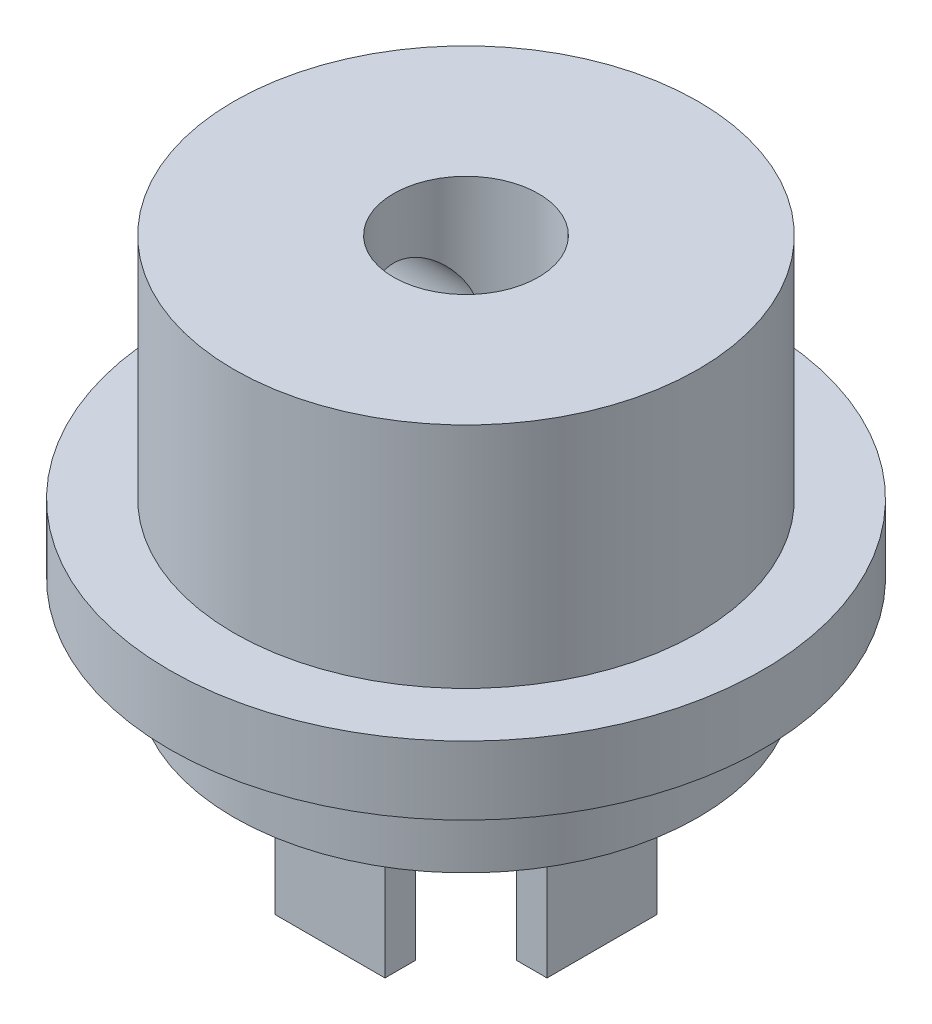
ISO-10303-21;
HEADER;
FILE_DESCRIPTION(('STEP AP214'),'2;1');
FILE_NAME('part.step','',(''),(''),'','','');
FILE_SCHEMA(('AUTOMOTIVE_DESIGN { 1 0 10303 214 1 1 1 1 }'));
ENDSEC;
DATA;
#1=APPLICATION_CONTEXT('core data for automotive mechanical design processes');
#2=APPLICATION_PROTOCOL_DEFINITION('international standard','automotive_design',2000,#1);
#3=PRODUCT_CONTEXT('',#1,'mechanical');
#4=PRODUCT('Part','Part','',(#3));
#5=PRODUCT_RELATED_PRODUCT_CATEGORY('part','',(#4));
#6=PRODUCT_DEFINITION_FORMATION('','',#4);
#7=PRODUCT_DEFINITION_CONTEXT('part definition',#1,'design');
#8=PRODUCT_DEFINITION('design','',#6,#7);
#9=PRODUCT_DEFINITION_SHAPE('','',#8);
#10=(LENGTH_UNIT() NAMED_UNIT(*) SI_UNIT(.MILLI.,.METRE.));
#11=(NAMED_UNIT(*) PLANE_ANGLE_UNIT() SI_UNIT($,.RADIAN.));
#12=(NAMED_UNIT(*) SI_UNIT($,.STERADIAN.) SOLID_ANGLE_UNIT());
#13=UNCERTAINTY_MEASURE_WITH_UNIT(LENGTH_MEASURE(1.E-05),#10,'distance_accuracy_value','');
#14=(GEOMETRIC_REPRESENTATION_CONTEXT(3) GLOBAL_UNCERTAINTY_ASSIGNED_CONTEXT((#13)) GLOBAL_UNIT_ASSIGNED_CONTEXT((#10,
#11,#12)) REPRESENTATION_CONTEXT('',''));
#15=CARTESIAN_POINT('',(0.,0.,0.));
#16=DIRECTION('',(0.,0.,1.));
#17=DIRECTION('',(1.,0.,0.));
#18=AXIS2_PLACEMENT_3D('',#15,#16,#17);
#19=CARTESIAN_POINT('',(0.,-3.,0.));
#20=DIRECTION('',(0.,1.,0.));
#21=DIRECTION('',(0.,0.,1.));
#22=AXIS2_PLACEMENT_3D('',#19,#20,#21);
#23=CYLINDRICAL_SURFACE('',#22,10.175);
#24=CARTESIAN_POINT('',(0.,-3.,0.));
#25=DIRECTION('',(0.,1.,0.));
#26=DIRECTION('',(0.,0.,1.));
#27=AXIS2_PLACEMENT_3D('',#24,#25,#26);
#28=CIRCLE('',#27,10.175);
#29=CARTESIAN_POINT('',(0.,-3.,10.175));
#30=VERTEX_POINT('',#29);
#31=EDGE_CURVE('E50',#30,#30,#28,.T.);
#32=ORIENTED_EDGE('',*,*,#31,.F.);
#33=EDGE_LOOP('',(#32));
#34=FACE_BOUND('',#33,.T.);
#35=CARTESIAN_POINT('',(0.,0.,0.));
#36=DIRECTION('',(0.,1.,0.));
#37=DIRECTION('',(0.,0.,1.));
#38=AXIS2_PLACEMENT_3D('',#35,#36,#37);
#39=CIRCLE('',#38,10.175);
#40=CARTESIAN_POINT('',(0.,0.,10.175));
#41=VERTEX_POINT('',#40);
#42=EDGE_CURVE('E56',#41,#41,#39,.T.);
#43=ORIENTED_EDGE('',*,*,#42,.T.);
#44=EDGE_LOOP('',(#43));
#45=FACE_BOUND('',#44,.T.);
#46=ADVANCED_FACE('F43',(#34,#45),#23,.F.);
#47=CARTESIAN_POINT('',(0.,-3.,0.));
#48=DIRECTION('',(0.,1.,0.));
#49=DIRECTION('',(0.,0.,1.));
#50=AXIS2_PLACEMENT_3D('',#47,#48,#49);
#51=CYLINDRICAL_SURFACE('',#50,13.);
#52=CARTESIAN_POINT('',(0.,-3.,0.));
#53=DIRECTION('',(0.,1.,0.));
#54=DIRECTION('',(0.,0.,1.));
#55=AXIS2_PLACEMENT_3D('',#52,#53,#54);
#56=CIRCLE('',#55,13.);
#57=CARTESIAN_POINT('',(0.,-3.,13.));
#58=VERTEX_POINT('',#57);
#59=EDGE_CURVE('E11',#58,#58,#56,.T.);
#60=ORIENTED_EDGE('',*,*,#59,.T.);
#61=EDGE_LOOP('',(#60));
#62=FACE_BOUND('',#61,.T.);
#63=CARTESIAN_POINT('',(0.,0.,0.));
#64=DIRECTION('',(0.,1.,0.));
#65=DIRECTION('',(0.,0.,1.));
#66=AXIS2_PLACEMENT_3D('',#63,#64,#65);
#67=CIRCLE('',#66,13.);
#68=CARTESIAN_POINT('',(0.,0.,13.));
#69=VERTEX_POINT('',#68);
#70=EDGE_CURVE('E46',#69,#69,#67,.T.);
#71=ORIENTED_EDGE('',*,*,#70,.F.);
#72=EDGE_LOOP('',(#71));
#73=FACE_BOUND('',#72,.T.);
#74=ADVANCED_FACE('F65',(#62,#73),#51,.T.);
#75=CARTESIAN_POINT('',(0.,-3.,0.));
#76=DIRECTION('',(0.,1.,0.));
#77=DIRECTION('',(0.,0.,1.));
#78=AXIS2_PLACEMENT_3D('',#75,#76,#77);
#79=PLANE('',#78);
#80=ORIENTED_EDGE('',*,*,#31,.T.);
#81=EDGE_LOOP('',(#80));
#82=FACE_BOUND('',#81,.T.);
#83=ORIENTED_EDGE('',*,*,#59,.F.);
#84=EDGE_LOOP('',(#83));
#85=FACE_BOUND('',#84,.T.);
#86=ADVANCED_FACE('F67',(#82,#85),#79,.F.);
#87=CARTESIAN_POINT('',(0.,0.,0.));
#88=DIRECTION('',(0.,1.,0.));
#89=DIRECTION('',(0.,0.,1.));
#90=AXIS2_PLACEMENT_3D('',#87,#88,#89);
#91=PLANE('',#90);
#92=ORIENTED_EDGE('',*,*,#42,.F.);
#93=EDGE_LOOP('',(#92));
#94=FACE_BOUND('',#93,.T.);
#95=ORIENTED_EDGE('',*,*,#70,.T.);
#96=EDGE_LOOP('',(#95));
#97=FACE_BOUND('',#96,.T.);
#98=ADVANCED_FACE('F63',(#94,#97),#91,.T.);
#99=CLOSED_SHELL('',(#46,#74,#86,#98));
#100=MANIFOLD_SOLID_BREP('B2',#99);
#101=CARTESIAN_POINT('',(0.,-7.,0.));
#102=DIRECTION('',(0.,1.,0.));
#103=DIRECTION('',(0.,0.,1.));
#104=AXIS2_PLACEMENT_3D('',#101,#102,#103);
#105=PLANE('',#104);
#106=DIRECTION('',(-1.,0.,0.));
#107=VECTOR('',#106,1.);
#108=CARTESIAN_POINT('',(2.40741004928687,-7.,-4.6111649552997));
#109=LINE('',#108,#107);
#110=CARTESIAN_POINT('',(2.40741004928687,-7.,-4.6111649552997));
#111=VERTEX_POINT('',#110);
#112=CARTESIAN_POINT('',(-2.40741004928404,-7.,-4.6111649552997));
#113=VERTEX_POINT('',#112);
#114=EDGE_CURVE('E244',#111,#113,#109,.T.);
#115=ORIENTED_EDGE('',*,*,#114,.F.);
#116=DIRECTION('',(0.,0.,1.));
#117=VECTOR('',#116,1.);
#118=CARTESIAN_POINT('',(2.40741004928687,-7.,-5.95931458289955));
#119=LINE('',#118,#117);
#120=CARTESIAN_POINT('',(2.40741004928687,-7.,-5.95931458289955));
#121=VERTEX_POINT('',#120);
#122=EDGE_CURVE('E257',#121,#111,#119,.T.);
#123=ORIENTED_EDGE('',*,*,#122,.F.);
#124=DIRECTION('',(1.,0.,0.));
#125=VECTOR('',#124,1.);
#126=CARTESIAN_POINT('',(2.40741004928687,-7.,-5.95931458289955));
#127=LINE('',#126,#125);
#128=CARTESIAN_POINT('',(-2.40741004928404,-7.,-5.95931458289955));
#129=VERTEX_POINT('',#128);
#130=EDGE_CURVE('E266',#129,#121,#127,.T.);
#131=ORIENTED_EDGE('',*,*,#130,.F.);
#132=DIRECTION('',(0.,0.,-1.));
#133=VECTOR('',#132,1.);
#134=CARTESIAN_POINT('',(-2.40741004928404,-7.,-5.95931458289955));
#135=LINE('',#134,#133);
#136=EDGE_CURVE('E247',#113,#129,#135,.T.);
#137=ORIENTED_EDGE('',*,*,#136,.F.);
#138=EDGE_LOOP('',(#115,#123,#131,#137));
#139=FACE_BOUND('',#138,.T.);
#140=DIRECTION('',(0.,0.,1.));
#141=VECTOR('',#140,1.);
#142=CARTESIAN_POINT('',(2.40741004928545,-7.,5.95931458289928));
#143=LINE('',#142,#141);
#144=CARTESIAN_POINT('',(2.40741004928545,-7.,4.61116495529942));
#145=VERTEX_POINT('',#144);
#146=CARTESIAN_POINT('',(2.40741004928545,-7.,5.95931458289928));
#147=VERTEX_POINT('',#146);
#148=EDGE_CURVE('E315',#145,#147,#143,.T.);
#149=ORIENTED_EDGE('',*,*,#148,.F.);
#150=DIRECTION('',(1.,0.,0.));
#151=VECTOR('',#150,1.);
#152=CARTESIAN_POINT('',(-2.40741004928545,-7.,4.61116495529942));
#153=LINE('',#152,#151);
#154=CARTESIAN_POINT('',(-2.40741004928545,-7.,4.61116495529942));
#155=VERTEX_POINT('',#154);
#156=EDGE_CURVE('E320',#155,#145,#153,.T.);
#157=ORIENTED_EDGE('',*,*,#156,.F.);
#158=DIRECTION('',(0.,0.,-1.));
#159=VECTOR('',#158,1.);
#160=CARTESIAN_POINT('',(-2.40741004928545,-7.,5.95931458289928));
#161=LINE('',#160,#159);
#162=CARTESIAN_POINT('',(-2.40741004928545,-7.,5.95931458289928));
#163=VERTEX_POINT('',#162);
#164=EDGE_CURVE('E332',#163,#155,#161,.T.);
#165=ORIENTED_EDGE('',*,*,#164,.F.);
#166=DIRECTION('',(-1.,0.,0.));
#167=VECTOR('',#166,1.);
#168=CARTESIAN_POINT('',(-2.40741004928545,-7.,5.95931458289928));
#169=LINE('',#168,#167);
#170=EDGE_CURVE('E329',#147,#163,#169,.T.);
#171=ORIENTED_EDGE('',*,*,#170,.F.);
#172=EDGE_LOOP('',(#149,#157,#165,#171));
#173=FACE_BOUND('',#172,.T.);
#174=CARTESIAN_POINT('',(0.,-7.,0.));
#175=DIRECTION('',(0.,1.,0.));
#176=DIRECTION('',(0.,0.,1.));
#177=AXIS2_PLACEMENT_3D('',#174,#175,#176);
#178=CIRCLE('',#177,3.175);
#179=CARTESIAN_POINT('',(0.,-7.,3.175));
#180=VERTEX_POINT('',#179);
#181=EDGE_CURVE('E118',#180,#180,#178,.T.);
#182=ORIENTED_EDGE('',*,*,#181,.T.);
#183=EDGE_LOOP('',(#182));
#184=FACE_BOUND('',#183,.T.);
#185=CARTESIAN_POINT('',(0.,-7.,0.));
#186=DIRECTION('',(0.,1.,0.));
#187=DIRECTION('',(0.,0.,1.));
#188=AXIS2_PLACEMENT_3D('',#185,#186,#187);
#189=CIRCLE('',#188,10.175);
#190=CARTESIAN_POINT('',(0.,-7.,10.175));
#191=VERTEX_POINT('',#190);
#192=EDGE_CURVE('E41',#191,#191,#189,.T.);
#193=ORIENTED_EDGE('',*,*,#192,.F.);
#194=EDGE_LOOP('',(#193));
#195=FACE_BOUND('',#194,.T.);
#196=DIRECTION('',(0.,0.,-1.));
#197=VECTOR('',#196,1.);
#198=CARTESIAN_POINT('',(4.61116495530027,-7.,2.40741004928602));
#199=LINE('',#198,#197);
#200=CARTESIAN_POINT('',(4.61116495530027,-7.,2.40741004928602));
#201=VERTEX_POINT('',#200);
#202=CARTESIAN_POINT('',(4.61116495530027,-7.,-2.40741004928489));
#203=VERTEX_POINT('',#202);
#204=EDGE_CURVE('E282',#201,#203,#199,.T.);
#205=ORIENTED_EDGE('',*,*,#204,.F.);
#206=DIRECTION('',(-1.,0.,0.));
#207=VECTOR('',#206,1.);
#208=CARTESIAN_POINT('',(5.95931458290012,-7.,2.40741004928602));
#209=LINE('',#208,#207);
#210=CARTESIAN_POINT('',(5.95931458290012,-7.,2.40741004928602));
#211=VERTEX_POINT('',#210);
#212=EDGE_CURVE('E287',#211,#201,#209,.T.);
#213=ORIENTED_EDGE('',*,*,#212,.F.);
#214=DIRECTION('',(0.,0.,1.));
#215=VECTOR('',#214,1.);
#216=CARTESIAN_POINT('',(5.95931458290012,-7.,2.40741004928602));
#217=LINE('',#216,#215);
#218=CARTESIAN_POINT('',(5.95931458290012,-7.,-2.40741004928489));
#219=VERTEX_POINT('',#218);
#220=EDGE_CURVE('E299',#219,#211,#217,.T.);
#221=ORIENTED_EDGE('',*,*,#220,.F.);
#222=DIRECTION('',(1.,0.,0.));
#223=VECTOR('',#222,1.);
#224=CARTESIAN_POINT('',(5.95931458290012,-7.,-2.40741004928489));
#225=LINE('',#224,#223);
#226=EDGE_CURVE('E296',#203,#219,#225,.T.);
#227=ORIENTED_EDGE('',*,*,#226,.F.);
#228=EDGE_LOOP('',(#205,#213,#221,#227));
#229=FACE_BOUND('',#228,.T.);
#230=DIRECTION('',(0.,0.,1.));
#231=VECTOR('',#230,1.);
#232=CARTESIAN_POINT('',(-4.61116495529885,-7.,-2.4074100492863));
#233=LINE('',#232,#231);
#234=CARTESIAN_POINT('',(-4.61116495529885,-7.,-2.4074100492863));
#235=VERTEX_POINT('',#234);
#236=CARTESIAN_POINT('',(-4.61116495529886,-7.,2.40741004928461));
#237=VERTEX_POINT('',#236);
#238=EDGE_CURVE('E243',#235,#237,#233,.T.);
#239=ORIENTED_EDGE('',*,*,#238,.F.);
#240=DIRECTION('',(1.,0.,0.));
#241=VECTOR('',#240,1.);
#242=CARTESIAN_POINT('',(-5.95931458289871,-7.,-2.4074100492863));
#243=LINE('',#242,#241);
#244=CARTESIAN_POINT('',(-5.95931458289871,-7.,-2.4074100492863));
#245=VERTEX_POINT('',#244);
#246=EDGE_CURVE('E240',#245,#235,#243,.T.);
#247=ORIENTED_EDGE('',*,*,#246,.F.);
#248=DIRECTION('',(0.,0.,-1.));
#249=VECTOR('',#248,1.);
#250=CARTESIAN_POINT('',(-5.95931458289871,-7.,-2.4074100492863));
#251=LINE('',#250,#249);
#252=CARTESIAN_POINT('',(-5.95931458289871,-7.,2.40741004928461));
#253=VERTEX_POINT('',#252);
#254=EDGE_CURVE('E130',#253,#245,#251,.T.);
#255=ORIENTED_EDGE('',*,*,#254,.F.);
#256=DIRECTION('',(-1.,0.,0.));
#257=VECTOR('',#256,1.);
#258=CARTESIAN_POINT('',(-5.95931458289871,-7.,2.40741004928461));
#259=LINE('',#258,#257);
#260=EDGE_CURVE('E125',#237,#253,#259,.T.);
#261=ORIENTED_EDGE('',*,*,#260,.F.);
#262=EDGE_LOOP('',(#239,#247,#255,#261));
#263=FACE_BOUND('',#262,.T.);
#264=ADVANCED_FACE('F105',(#139,#173,#184,#195,#229,#263),#105,.F.);
#265=CARTESIAN_POINT('',(0.,-7.,0.));
#266=DIRECTION('',(0.,1.,0.));
#267=DIRECTION('',(0.,0.,1.));
#268=AXIS2_PLACEMENT_3D('',#265,#266,#267);
#269=CYLINDRICAL_SURFACE('',#268,3.175);
#270=CARTESIAN_POINT('',(-1.95719825260498,4.86410503907142,-2.5));
#271=CARTESIAN_POINT('',(-1.95721075169231,4.76832436182433,-2.49999447236128));
#272=CARTESIAN_POINT('',(-1.96437191251867,4.67237339764898,-2.49443337341084));
#273=CARTESIAN_POINT('',(-1.99164950596025,4.48346785551043,-2.47269802838703));
#274=CARTESIAN_POINT('',(-2.01180875922408,4.3905242516613,-2.45648869966638));
#275=CARTESIAN_POINT('',(-2.07027481138451,4.17933790937585,-2.40758361920293));
#276=CARTESIAN_POINT('',(-2.11239727587421,4.06303950554195,-2.37118569204213));
#277=CARTESIAN_POINT('',(-2.20650266998979,3.8402329990593,-2.28387641619085));
#278=CARTESIAN_POINT('',(-2.25851223694881,3.73375252555013,-2.23292566927072));
#279=CARTESIAN_POINT('',(-2.34876660563399,3.56436054091275,-2.13698869055989));
#280=CARTESIAN_POINT('',(-2.38584873735904,3.49872066756338,-2.09563805984771));
#281=CARTESIAN_POINT('',(-2.46068640535453,3.37179752925448,-2.00723862811578));
#282=CARTESIAN_POINT('',(-2.4984421639608,3.31051573727896,-1.96018791492023));
#283=CARTESIAN_POINT('',(-2.61101812518646,3.13345825894803,-1.81071879461074));
#284=CARTESIAN_POINT('',(-2.68528959613172,3.0242179532101,-1.69983988564081));
#285=CARTESIAN_POINT('',(-2.81136367391038,2.84511794384306,-1.47978320555189));
#286=CARTESIAN_POINT('',(-2.86474271419252,2.7717240488581,-1.37436385643687));
#287=CARTESIAN_POINT('',(-2.96185521398434,2.64061492536613,-1.15016714791312));
#288=CARTESIAN_POINT('',(-3.00560335820121,2.58287579568211,-1.03141054795503));
#289=CARTESIAN_POINT('',(-3.07392493069457,2.49364733586426,-0.802233331388993));
#290=CARTESIAN_POINT('',(-3.10043347031878,2.45945547380733,-0.69344743460731));
#291=CARTESIAN_POINT('',(-3.14204719705814,2.40603264247984,-0.470139756100864));
#292=CARTESIAN_POINT('',(-3.15715850417786,2.38679364375797,-0.355621087999897));
#293=CARTESIAN_POINT('',(-3.17472822821248,2.36444048542371,-0.123660154731445));
#294=CARTESIAN_POINT('',(-3.17714600030234,2.36137812336998,-0.0062097065807606));
#295=CARTESIAN_POINT('',(-3.16899681649672,2.37173149021782,0.22750441833334));
#296=CARTESIAN_POINT('',(-3.15842886844224,2.38514847820514,0.343768003731508));
#297=CARTESIAN_POINT('',(-3.12608559162597,2.42649544476959,0.565852224845868));
#298=CARTESIAN_POINT('',(-3.10489778528708,2.45366528308294,0.671904277891052));
#299=CARTESIAN_POINT('',(-3.05317778328859,2.52066272796128,0.877484407352706));
#300=CARTESIAN_POINT('',(-3.0226432995191,2.56049343405716,0.977010879024692));
#301=CARTESIAN_POINT('',(-2.95066067256051,2.65574702107126,1.17757547829714));
#302=CARTESIAN_POINT('',(-2.90842845895081,2.7123277190199,1.27777693584085));
#303=CARTESIAN_POINT('',(-2.81747237418175,2.83695422502859,1.46750258967018));
#304=CARTESIAN_POINT('',(-2.76874442105259,2.90500724955595,1.55702000443013));
#305=CARTESIAN_POINT('',(-2.65698234712223,3.06605813447808,1.74212941612336));
#306=CARTESIAN_POINT('',(-2.59306033584936,3.16131126777215,1.83522053693038));
#307=CARTESIAN_POINT('',(-2.46410767145485,3.36495434913081,2.00503358523309));
#308=CARTESIAN_POINT('',(-2.39907592297748,3.47335800914779,2.08173819259082));
#309=CARTESIAN_POINT('',(-2.28171947667162,3.68824054189784,2.20927515200357));
#310=CARTESIAN_POINT('',(-2.22883366229413,3.7931903195443,2.26216227524491));
#311=CARTESIAN_POINT('',(-2.13198563310776,4.01297784685742,2.35365348343213));
#312=CARTESIAN_POINT('',(-2.08800385661369,4.12779311376719,2.39228903537355));
#313=CARTESIAN_POINT('',(-2.02604102671192,4.33398068383053,2.44478481794629));
#314=CARTESIAN_POINT('',(-2.00423908887061,4.42318380796392,2.46253036675663));
#315=CARTESIAN_POINT('',(-1.97226479593825,4.60496674355094,2.48821874730317));
#316=CARTESIAN_POINT('',(-1.96206915037309,4.69753940647193,2.49618121341621));
#317=CARTESIAN_POINT('',(-1.95507676486106,4.8839323695862,2.50166511813577));
#318=CARTESIAN_POINT('',(-1.95833801419487,4.97775632914289,2.49914136857015));
#319=CARTESIAN_POINT('',(-1.9777629503675,5.16323812371579,2.4837904136282));
#320=CARTESIAN_POINT('',(-1.9939456286518,5.25489256574032,2.47094804214288));
#321=CARTESIAN_POINT('',(-2.04269202579632,5.45951362981662,2.43089947869067));
#322=CARTESIAN_POINT('',(-2.0786240519934,5.57104780530295,2.40062878241031));
#323=CARTESIAN_POINT('',(-2.16099097628234,5.78560818871826,2.32675572845551));
#324=CARTESIAN_POINT('',(-2.20745812820209,5.88860691409943,2.28311228209209));
#325=CARTESIAN_POINT('',(-2.29109559428482,6.05661762605404,2.19862055731557));
#326=CARTESIAN_POINT('',(-2.32694187344345,6.12384349992872,2.16077463414898));
#327=CARTESIAN_POINT('',(-2.39992654867346,6.25404298787605,2.07941580119929));
#328=CARTESIAN_POINT('',(-2.43706544969451,6.31701491128433,2.03590065816375));
#329=CARTESIAN_POINT('',(-2.54865903530003,6.49945091260436,1.89710266954057));
#330=CARTESIAN_POINT('',(-2.62338379828428,6.61261038030615,1.79347840518051));
#331=CARTESIAN_POINT('',(-2.755186087639,6.80432151650832,1.58200319117129));
#332=CARTESIAN_POINT('',(-2.81322714464391,6.88551855081284,1.47713433165703));
#333=CARTESIAN_POINT('',(-2.9201229355871,7.0318206872226,1.25255376358082));
#334=CARTESIAN_POINT('',(-2.96899319348211,7.09695304282025,1.13286771767326));
#335=CARTESIAN_POINT('',(-3.04592840730062,7.19818455038942,0.902755701220927));
#336=CARTESIAN_POINT('',(-3.07614219469052,7.23737753867712,0.794415630020151));
#337=CARTESIAN_POINT('',(-3.12532698295601,7.30079303377721,0.570970790020552));
#338=CARTESIAN_POINT('',(-3.1443044114717,7.32502409973954,0.455869930164103));
#339=CARTESIAN_POINT('',(-3.1694648461537,7.35709173536278,0.221491072760628));
#340=CARTESIAN_POINT('',(-3.17559361516291,7.36485880823256,0.102197520539327));
#341=CARTESIAN_POINT('',(-3.17431536360188,7.36323567242425,-0.136196963829557));
#342=CARTESIAN_POINT('',(-3.16690928004944,7.35384665146251,-0.255297908740016));
#343=CARTESIAN_POINT('',(-3.14021372669927,7.31979583948672,-0.481424827046353));
#344=CARTESIAN_POINT('',(-3.12176949088846,7.29621975794112,-0.588720236505493));
#345=CARTESIAN_POINT('',(-3.07511471033747,7.23603796806441,-0.797326733123978));
#346=CARTESIAN_POINT('',(-3.04690179814027,7.1994291011527,-0.898636362644527));
#347=CARTESIAN_POINT('',(-2.97991927239995,7.11136512416133,-1.10136258101786));
#348=CARTESIAN_POINT('',(-2.94048660131764,7.05895797376129,-1.20214178173562));
#349=CARTESIAN_POINT('',(-2.85473910809604,6.94267473998173,-1.39359684032079));
#350=CARTESIAN_POINT('',(-2.80842104356986,6.87879325027578,-1.48426790279167));
#351=CARTESIAN_POINT('',(-2.70178492176021,6.72755675496219,-1.67175774015245));
#352=CARTESIAN_POINT('',(-2.64050297155001,6.63805529631186,-1.7662929447047));
#353=CARTESIAN_POINT('',(-2.51569911229819,6.44633117426267,-1.93992886340218));
#354=CARTESIAN_POINT('',(-2.45217432101263,6.34409168085138,-2.01900879557962));
#355=CARTESIAN_POINT('',(-2.33030193367269,6.13176983315963,-2.15836308774721));
#356=CARTESIAN_POINT('',(-2.27184898336882,6.0221539484283,-2.21925463587651));
#357=CARTESIAN_POINT('',(-2.16342454744917,5.79151805072031,-2.32506586147903));
#358=CARTESIAN_POINT('',(-2.113437728414,5.67051928594596,-2.37001457897067));
#359=CARTESIAN_POINT('',(-2.04288134256525,5.45547176865974,-2.4307936143745));
#360=CARTESIAN_POINT('',(-2.01798502740241,5.36419523896662,-2.45131250381516));
#361=CARTESIAN_POINT('',(-1.98007726796828,5.17765041104419,-2.4820431181016));
#362=CARTESIAN_POINT('',(-1.96702086442828,5.08239866218761,-2.4922938495076));
#363=CARTESIAN_POINT('',(-1.95975197357666,4.96620605687404,-2.49799845617343));
#364=CARTESIAN_POINT('',(-1.95879672593727,4.9458081222195,-2.49874794671915));
#365=CARTESIAN_POINT('',(-1.95751848464195,4.90497772628362,-2.49974934552975));
#366=CARTESIAN_POINT('',(-1.95719558521823,4.88454526031043,-2.50000117963416));
#367=CARTESIAN_POINT('',(-1.95719825260498,4.86410503907142,-2.5));
#368=B_SPLINE_CURVE_WITH_KNOTS('',3,(#270,#271,#272,#273,#274,#275,#276,#277,#278,#279,#280,
#281,#282,#283,#284,#285,#286,#287,#288,#289,#290,#291,#292,#293,#294,#295,#296,#297,#298,#299,
#300,#301,#302,#303,#304,#305,#306,#307,#308,#309,#310,#311,#312,#313,#314,#315,#316,#317,#318,
#319,#320,#321,#322,#323,#324,#325,#326,#327,#328,#329,#330,#331,#332,#333,#334,#335,#336,#337,
#338,#339,#340,#341,#342,#343,#344,#345,#346,#347,#348,#349,#350,#351,#352,#353,#354,#355,#356,
#357,#358,#359,#360,#361,#362,#363,#364,#365,#366,#367),.UNSPECIFIED.,.T.,.F.,(4,2,2,2,2,2,2,2,
2,2,2,2,2,2,2,2,2,2,2,2,2,2,2,2,2,2,2,2,2,2,2,2,2,2,2,2,2,2,2,2,2,2,2,2,2,2,2,2,4),(0.,
0.287252325627619,0.575455838274756,0.960121318810387,1.3458382221893,1.60349953630363,
1.86124752726355,2.37578413095267,2.79155991718981,3.20669728966613,3.55642581001495,
3.90596640167378,4.25662554616209,4.60731148402479,4.9404421516329,5.27365443647924,
5.64005307219118,6.00668305050907,6.4482827063719,6.89034683769375,7.2758373343413,
7.66047151249733,7.93998265633263,8.21893190782196,8.49908447719316,8.77964956421464,
9.14073286425413,9.50293693566537,9.75783651820509,10.0128368176257,10.5221928227142,
10.9549071669286,11.3868822887833,11.742721102557,12.0983561653511,12.4554894477909,
12.8125980068311,13.1453423572624,13.4781674054196,13.837568044136,14.1971384667909,
14.6272495168196,15.0579349965137,15.4716853910444,15.8846782173803,16.1740692574231,
16.4623567449392,16.5236491317194,16.5849506515667),.UNSPECIFIED.);
#369=CARTESIAN_POINT('',(-1.95719825260498,4.86410503907142,-2.5));
#370=VERTEX_POINT('',#369);
#371=EDGE_CURVE('E348',#370,#370,#368,.T.);
#372=ORIENTED_EDGE('',*,*,#371,.T.);
#373=EDGE_LOOP('',(#372));
#374=FACE_BOUND('',#373,.T.);
#375=ORIENTED_EDGE('',*,*,#181,.F.);
#376=EDGE_LOOP('',(#375));
#377=FACE_BOUND('',#376,.T.);
#378=CARTESIAN_POINT('',(0.,10.,0.));
#379=DIRECTION('',(0.,1.,0.));
#380=DIRECTION('',(0.,0.,1.));
#381=AXIS2_PLACEMENT_3D('',#378,#379,#380);
#382=CIRCLE('',#381,3.175);
#383=CARTESIAN_POINT('',(0.,10.,3.175));
#384=VERTEX_POINT('',#383);
#385=EDGE_CURVE('E353',#384,#384,#382,.T.);
#386=ORIENTED_EDGE('',*,*,#385,.T.);
#387=EDGE_LOOP('',(#386));
#388=FACE_BOUND('',#387,.T.);
#389=ADVANCED_FACE('F107',(#374,#377,#388),#269,.F.);
#390=CARTESIAN_POINT('',(0.,-7.,0.));
#391=DIRECTION('',(0.,1.,0.));
#392=DIRECTION('',(0.,0.,1.));
#393=AXIS2_PLACEMENT_3D('',#390,#391,#392);
#394=CYLINDRICAL_SURFACE('',#393,10.175);
#395=CARTESIAN_POINT('',(-9.86309408857078,4.86410503907142,-2.5));
#396=CARTESIAN_POINT('',(-9.86309676784837,4.72597254427932,-2.49999594219182));
#397=CARTESIAN_POINT('',(-9.86602758145947,4.58779462145661,-2.48851265852643));
#398=CARTESIAN_POINT('',(-9.87740546527068,4.31540120336856,-2.44295279364418));
#399=CARTESIAN_POINT('',(-9.88585585721429,4.18118814507315,-2.40886260715347));
#400=CARTESIAN_POINT('',(-9.90725937182408,3.9207038650829,-2.31925430895375));
#401=CARTESIAN_POINT('',(-9.92020680728172,3.794422849159,-2.26376325222597));
#402=CARTESIAN_POINT('',(-9.94913851814769,3.55295047270547,-2.13301014885365));
#403=CARTESIAN_POINT('',(-9.96512289535034,3.43775948409414,-2.05774743945677));
#404=CARTESIAN_POINT('',(-9.99870781623312,3.21928769195896,-1.88787865386823));
#405=CARTESIAN_POINT('',(-10.01633345922,3.11627739942293,-1.79292956334346));
#406=CARTESIAN_POINT('',(-10.0509969320076,2.92747219858927,-1.58712235501006));
#407=CARTESIAN_POINT('',(-10.068034708156,2.84167885819236,-1.47626278985338));
#408=CARTESIAN_POINT('',(-10.099879835418,2.68864145246497,-1.23993397978449));
#409=CARTESIAN_POINT('',(-10.1146541129757,2.62166233431926,-1.11428832334559));
#410=CARTESIAN_POINT('',(-10.1400216455027,2.50987611410329,-0.853098250439842));
#411=CARTESIAN_POINT('',(-10.1506154956497,2.46506585556777,-0.717555246341194));
#412=CARTESIAN_POINT('',(-10.1662511083875,2.39975355807433,-0.443237170986847));
#413=CARTESIAN_POINT('',(-10.1713976076958,2.3787923558264,-0.304577494385627));
#414=CARTESIAN_POINT('',(-10.1759233260598,2.36033271808146,-0.0256206615411511));
#415=CARTESIAN_POINT('',(-10.1753033698505,2.36283092735219,0.114676257672372));
#416=CARTESIAN_POINT('',(-10.1684442971652,2.39088725397607,0.389743302861848));
#417=CARTESIAN_POINT('',(-10.1623259313743,2.41594985583312,0.524567433281939));
#418=CARTESIAN_POINT('',(-10.1452976520971,2.48762804928351,0.788034713361876));
#419=CARTESIAN_POINT('',(-10.1343874885182,2.53424476583129,0.916677540019607));
#420=CARTESIAN_POINT('',(-10.1088153870419,2.64811416326325,1.16544609141994));
#421=CARTESIAN_POINT('',(-10.0941212776539,2.71554483486289,1.2854869012649));
#422=CARTESIAN_POINT('',(-10.0625777724023,2.86899337080081,1.5127238512549));
#423=CARTESIAN_POINT('',(-10.0457280132513,2.95501436981854,1.61991782043601));
#424=CARTESIAN_POINT('',(-10.011191707583,3.14586424272665,1.82137250766904));
#425=CARTESIAN_POINT('',(-9.99349480176581,3.25112626222717,1.91522153454466));
#426=CARTESIAN_POINT('',(-9.95966348285104,3.47607973012399,2.08402520416538));
#427=CARTESIAN_POINT('',(-9.94352913778416,3.59577180626646,2.15897902447955));
#428=CARTESIAN_POINT('',(-9.91461388925663,3.84697451952917,2.28811618475015));
#429=CARTESIAN_POINT('',(-9.90184856607041,3.97853641667875,2.34220354026066));
#430=CARTESIAN_POINT('',(-9.88131847017733,4.24927440178859,2.42736688751309));
#431=CARTESIAN_POINT('',(-9.87355266867158,4.38844891682893,2.45844761374413));
#432=CARTESIAN_POINT('',(-9.86411597427821,4.66665161594382,2.49603890066637));
#433=CARTESIAN_POINT('',(-9.8622944538907,4.80559271938172,2.50315682706083));
#434=CARTESIAN_POINT('',(-9.86454308273412,5.08267733803208,2.494280596621));
#435=CARTESIAN_POINT('',(-9.86861271011067,5.22082092280267,2.4782884869387));
#436=CARTESIAN_POINT('',(-9.88204104642639,5.49015444659979,2.42417792222333));
#437=CARTESIAN_POINT('',(-9.89131583528208,5.62141944804862,2.38641028465188));
#438=CARTESIAN_POINT('',(-9.91403036005937,5.8757558356995,2.29020837658652));
#439=CARTESIAN_POINT('',(-9.92747057626518,5.99882627505904,2.23177172279342));
#440=CARTESIAN_POINT('',(-9.95732071085483,6.23586144503668,2.09460973508973));
#441=CARTESIAN_POINT('',(-9.97378224758645,6.34960848128735,2.01551967443041));
#442=CARTESIAN_POINT('',(-10.007692251284,6.56243939922579,1.83975941403843));
#443=CARTESIAN_POINT('',(-10.0251408743586,6.66152095254124,1.74308642816297));
#444=CARTESIAN_POINT('',(-10.0595675102473,6.8446536980679,1.53212264895494));
#445=CARTESIAN_POINT('',(-10.0765240789846,6.92828559380268,1.41746373105726));
#446=CARTESIAN_POINT('',(-10.1076202528497,7.07510663274098,1.17537594744831));
#447=CARTESIAN_POINT('',(-10.1217600034499,7.13829683174669,1.04794774170901));
#448=CARTESIAN_POINT('',(-10.1455411458153,7.24190161943094,0.784811185158856));
#449=CARTESIAN_POINT('',(-10.1552143797444,7.28247786873049,0.649169497968243));
#450=CARTESIAN_POINT('',(-10.1691117529373,7.34019160151072,0.372724460430216));
#451=CARTESIAN_POINT('',(-10.1733369056173,7.35733344414126,0.231922075054687));
#452=CARTESIAN_POINT('',(-10.1758223152712,7.36745358658064,-0.0469026946472942));
#453=CARTESIAN_POINT('',(-10.1742355711941,7.36105166102097,-0.184901566996437));
#454=CARTESIAN_POINT('',(-10.1656130929476,7.32568074536617,-0.457793010824959));
#455=CARTESIAN_POINT('',(-10.1585775108356,7.29671238501821,-0.592685668879339));
#456=CARTESIAN_POINT('',(-10.1398698124543,7.21735852446334,-0.854911143893905));
#457=CARTESIAN_POINT('',(-10.1282212309963,7.16708164697816,-0.982278620110472));
#458=CARTESIAN_POINT('',(-10.1015164923471,7.04663713676417,-1.22684148831988));
#459=CARTESIAN_POINT('',(-10.0864599187108,6.97646707289017,-1.34403563474269));
#460=CARTESIAN_POINT('',(-10.0541278284115,6.81631891972497,-1.56787656271792));
#461=CARTESIAN_POINT('',(-10.0368088419478,6.72591802475441,-1.6742145734957));
#462=CARTESIAN_POINT('',(-10.0021046166832,6.52869994141318,-1.87042185484412));
#463=CARTESIAN_POINT('',(-9.98471936232312,6.42187863228289,-1.96028697904113));
#464=CARTESIAN_POINT('',(-9.95149865272974,6.19255599045942,-2.12256913552064));
#465=CARTESIAN_POINT('',(-9.9356964124223,6.06980874117546,-2.1946459751715));
#466=CARTESIAN_POINT('',(-9.9078731170475,5.81356995096174,-2.31703312284928));
#467=CARTESIAN_POINT('',(-9.89584924573603,5.68008650601407,-2.36735965323307));
#468=CARTESIAN_POINT('',(-9.87887417719641,5.43300015701334,-2.43710499187005));
#469=CARTESIAN_POINT('',(-9.87300038134246,5.32060484817955,-2.460640144982));
#470=CARTESIAN_POINT('',(-9.86510937691319,5.09351836269785,-2.49208871643206));
#471=CARTESIAN_POINT('',(-9.86309186336689,4.97882736832734,-2.50000337010641));
#472=CARTESIAN_POINT('',(-9.86309408857078,4.86410503907142,-2.5));
#473=B_SPLINE_CURVE_WITH_KNOTS('',3,(#395,#396,#397,#398,#399,#400,#401,#402,#403,#404,#405,
#406,#407,#408,#409,#410,#411,#412,#413,#414,#415,#416,#417,#418,#419,#420,#421,#422,#423,#424,
#425,#426,#427,#428,#429,#430,#431,#432,#433,#434,#435,#436,#437,#438,#439,#440,#441,#442,#443,
#444,#445,#446,#447,#448,#449,#450,#451,#452,#453,#454,#455,#456,#457,#458,#459,#460,#461,#462,
#463,#464,#465,#466,#467,#468,#469,#470,#471,#472),.UNSPECIFIED.,.T.,.F.,(4,2,2,2,2,2,2,2,2,2,2,
2,2,2,2,2,2,2,2,2,2,2,2,2,2,2,2,2,2,2,2,2,2,2,2,2,2,2,4),(0.,0.413976318272837,
0.828202001918613,1.24190572897441,1.65562332528618,2.07726837379911,2.49895180296519,
2.92630564510959,3.35359862187415,3.77251785953185,4.19137718307269,4.60125683699243,
5.0111578858061,5.42466615130566,5.83824419656748,6.26264143469591,6.68705714190909,
7.113402496917,7.53966009074022,7.95502888870354,8.37036089438583,8.77918151276966,
9.18804928674381,9.60469318532743,10.0214031617861,10.4481456899295,10.8748661735399,
11.2984956884036,11.7220463911193,12.134528161008,12.5469984204421,12.957390884375,
13.367833523984,13.7878239264783,14.2079198996027,14.6355168461074,15.0627943189144,
15.4066387119774,15.7504559112579),.UNSPECIFIED.);
#474=CARTESIAN_POINT('',(-9.86309408857078,4.86410503907142,-2.5));
#475=VERTEX_POINT('',#474);
#476=EDGE_CURVE('E110',#475,#475,#473,.T.);
#477=ORIENTED_EDGE('',*,*,#476,.F.);
#478=EDGE_LOOP('',(#477));
#479=FACE_BOUND('',#478,.T.);
#480=ORIENTED_EDGE('',*,*,#192,.T.);
#481=EDGE_LOOP('',(#480));
#482=FACE_BOUND('',#481,.T.);
#483=CARTESIAN_POINT('',(0.,10.,0.));
#484=DIRECTION('',(0.,1.,0.));
#485=DIRECTION('',(0.,0.,1.));
#486=AXIS2_PLACEMENT_3D('',#483,#484,#485);
#487=CIRCLE('',#486,10.175);
#488=CARTESIAN_POINT('',(0.,10.,10.175));
#489=VERTEX_POINT('',#488);
#490=EDGE_CURVE('E385',#489,#489,#487,.T.);
#491=ORIENTED_EDGE('',*,*,#490,.F.);
#492=EDGE_LOOP('',(#491));
#493=FACE_BOUND('',#492,.T.);
#494=ADVANCED_FACE('F367',(#479,#482,#493),#394,.T.);
#495=CARTESIAN_POINT('',(0.,10.,0.));
#496=DIRECTION('',(0.,1.,0.));
#497=DIRECTION('',(0.,0.,1.));
#498=AXIS2_PLACEMENT_3D('',#495,#496,#497);
#499=PLANE('',#498);
#500=ORIENTED_EDGE('',*,*,#385,.F.);
#501=EDGE_LOOP('',(#500));
#502=FACE_BOUND('',#501,.T.);
#503=ORIENTED_EDGE('',*,*,#490,.T.);
#504=EDGE_LOOP('',(#503));
#505=FACE_BOUND('',#504,.T.);
#506=ADVANCED_FACE('F361',(#502,#505),#499,.T.);
#507=CARTESIAN_POINT('',(-11.,4.86410503907142,0.));
#508=DIRECTION('',(1.,0.,0.));
#509=DIRECTION('',(0.,0.,-1.));
#510=AXIS2_PLACEMENT_3D('',#507,#508,#509);
#511=CYLINDRICAL_SURFACE('',#510,2.5);
#512=ORIENTED_EDGE('',*,*,#476,.T.);
#513=EDGE_LOOP('',(#512));
#514=FACE_BOUND('',#513,.T.);
#515=ORIENTED_EDGE('',*,*,#371,.F.);
#516=EDGE_LOOP('',(#515));
#517=FACE_BOUND('',#516,.T.);
#518=ADVANCED_FACE('F355',(#514,#517),#511,.F.);
#519=CARTESIAN_POINT('',(2.40741004928545,-14.,5.95931458289928));
#520=DIRECTION('',(-1.,0.,0.));
#521=DIRECTION('',(0.,0.,1.));
#522=AXIS2_PLACEMENT_3D('',#519,#520,#521);
#523=PLANE('',#522);
#524=ORIENTED_EDGE('',*,*,#148,.T.);
#525=DIRECTION('',(0.,1.,0.));
#526=VECTOR('',#525,1.);
#527=CARTESIAN_POINT('',(2.40741004928545,-14.,5.95931458289928));
#528=LINE('',#527,#526);
#529=CARTESIAN_POINT('',(2.40741004928545,-14.,5.95931458289928));
#530=VERTEX_POINT('',#529);
#531=EDGE_CURVE('E345',#530,#147,#528,.T.);
#532=ORIENTED_EDGE('',*,*,#531,.F.);
#533=DIRECTION('',(0.,0.,1.));
#534=VECTOR('',#533,1.);
#535=CARTESIAN_POINT('',(2.40741004928545,-14.,5.95931458289928));
#536=LINE('',#535,#534);
#537=CARTESIAN_POINT('',(2.40741004928545,-14.,4.61116495529942));
#538=VERTEX_POINT('',#537);
#539=EDGE_CURVE('E316',#538,#530,#536,.T.);
#540=ORIENTED_EDGE('',*,*,#539,.F.);
#541=DIRECTION('',(0.,1.,0.));
#542=VECTOR('',#541,1.);
#543=CARTESIAN_POINT('',(2.40741004928545,-14.,4.61116495529942));
#544=LINE('',#543,#542);
#545=EDGE_CURVE('E326',#538,#145,#544,.T.);
#546=ORIENTED_EDGE('',*,*,#545,.T.);
#547=EDGE_LOOP('',(#524,#532,#540,#546));
#548=FACE_BOUND('',#547,.T.);
#549=ADVANCED_FACE('F360',(#548),#523,.F.);
#550=CARTESIAN_POINT('',(-2.40741004928545,-14.,5.95931458289928));
#551=DIRECTION('',(0.,0.,-1.));
#552=DIRECTION('',(-1.,0.,0.));
#553=AXIS2_PLACEMENT_3D('',#550,#551,#552);
#554=PLANE('',#553);
#555=ORIENTED_EDGE('',*,*,#170,.T.);
#556=DIRECTION('',(0.,1.,0.));
#557=VECTOR('',#556,1.);
#558=CARTESIAN_POINT('',(-2.40741004928545,-14.,5.95931458289928));
#559=LINE('',#558,#557);
#560=CARTESIAN_POINT('',(-2.40741004928545,-14.,5.95931458289928));
#561=VERTEX_POINT('',#560);
#562=EDGE_CURVE('E342',#561,#163,#559,.T.);
#563=ORIENTED_EDGE('',*,*,#562,.F.);
#564=DIRECTION('',(-1.,0.,0.));
#565=VECTOR('',#564,1.);
#566=CARTESIAN_POINT('',(-2.40741004928545,-14.,5.95931458289928));
#567=LINE('',#566,#565);
#568=EDGE_CURVE('E319',#530,#561,#567,.T.);
#569=ORIENTED_EDGE('',*,*,#568,.F.);
#570=ORIENTED_EDGE('',*,*,#531,.T.);
#571=EDGE_LOOP('',(#555,#563,#569,#570));
#572=FACE_BOUND('',#571,.T.);
#573=ADVANCED_FACE('F474',(#572),#554,.F.);
#574=CARTESIAN_POINT('',(-2.40741004928545,-14.,5.95931458289928));
#575=DIRECTION('',(1.,0.,0.));
#576=DIRECTION('',(0.,0.,-1.));
#577=AXIS2_PLACEMENT_3D('',#574,#575,#576);
#578=PLANE('',#577);
#579=ORIENTED_EDGE('',*,*,#164,.T.);
#580=DIRECTION('',(0.,1.,0.));
#581=VECTOR('',#580,1.);
#582=CARTESIAN_POINT('',(-2.40741004928545,-14.,4.61116495529942));
#583=LINE('',#582,#581);
#584=CARTESIAN_POINT('',(-2.40741004928545,-14.,4.61116495529942));
#585=VERTEX_POINT('',#584);
#586=EDGE_CURVE('E339',#585,#155,#583,.T.);
#587=ORIENTED_EDGE('',*,*,#586,.F.);
#588=DIRECTION('',(0.,0.,-1.));
#589=VECTOR('',#588,1.);
#590=CARTESIAN_POINT('',(-2.40741004928545,-14.,5.95931458289928));
#591=LINE('',#590,#589);
#592=EDGE_CURVE('E322',#561,#585,#591,.T.);
#593=ORIENTED_EDGE('',*,*,#592,.F.);
#594=ORIENTED_EDGE('',*,*,#562,.T.);
#595=EDGE_LOOP('',(#579,#587,#593,#594));
#596=FACE_BOUND('',#595,.T.);
#597=ADVANCED_FACE('F471',(#596),#578,.F.);
#598=CARTESIAN_POINT('',(-2.40741004928545,-14.,4.61116495529942));
#599=DIRECTION('',(0.,0.,1.));
#600=DIRECTION('',(1.,0.,0.));
#601=AXIS2_PLACEMENT_3D('',#598,#599,#600);
#602=PLANE('',#601);
#603=ORIENTED_EDGE('',*,*,#156,.T.);
#604=ORIENTED_EDGE('',*,*,#545,.F.);
#605=DIRECTION('',(1.,0.,0.));
#606=VECTOR('',#605,1.);
#607=CARTESIAN_POINT('',(-2.40741004928545,-14.,4.61116495529942));
#608=LINE('',#607,#606);
#609=EDGE_CURVE('E324',#585,#538,#608,.T.);
#610=ORIENTED_EDGE('',*,*,#609,.F.);
#611=ORIENTED_EDGE('',*,*,#586,.T.);
#612=EDGE_LOOP('',(#603,#604,#610,#611));
#613=FACE_BOUND('',#612,.T.);
#614=ADVANCED_FACE('F467',(#613),#602,.F.);
#615=CARTESIAN_POINT('',(0.,-14.,0.));
#616=DIRECTION('',(0.,-1.,0.));
#617=DIRECTION('',(0.,0.,-1.));
#618=AXIS2_PLACEMENT_3D('',#615,#616,#617);
#619=PLANE('',#618);
#620=ORIENTED_EDGE('',*,*,#539,.T.);
#621=ORIENTED_EDGE('',*,*,#568,.T.);
#622=ORIENTED_EDGE('',*,*,#592,.T.);
#623=ORIENTED_EDGE('',*,*,#609,.T.);
#624=EDGE_LOOP('',(#620,#621,#622,#623));
#625=FACE_BOUND('',#624,.T.);
#626=ADVANCED_FACE('F463',(#625),#619,.T.);
#627=CARTESIAN_POINT('',(4.61116495530027,-14.,2.40741004928602));
#628=DIRECTION('',(1.,0.,0.));
#629=DIRECTION('',(0.,0.,-1.));
#630=AXIS2_PLACEMENT_3D('',#627,#628,#629);
#631=PLANE('',#630);
#632=ORIENTED_EDGE('',*,*,#204,.T.);
#633=DIRECTION('',(0.,1.,0.));
#634=VECTOR('',#633,1.);
#635=CARTESIAN_POINT('',(4.61116495530027,-14.,-2.40741004928489));
#636=LINE('',#635,#634);
#637=CARTESIAN_POINT('',(4.61116495530027,-14.,-2.40741004928489));
#638=VERTEX_POINT('',#637);
#639=EDGE_CURVE('E312',#638,#203,#636,.T.);
#640=ORIENTED_EDGE('',*,*,#639,.F.);
#641=DIRECTION('',(0.,0.,-1.));
#642=VECTOR('',#641,1.);
#643=CARTESIAN_POINT('',(4.61116495530027,-14.,2.40741004928602));
#644=LINE('',#643,#642);
#645=CARTESIAN_POINT('',(4.61116495530027,-14.,2.40741004928602));
#646=VERTEX_POINT('',#645);
#647=EDGE_CURVE('E283',#646,#638,#644,.T.);
#648=ORIENTED_EDGE('',*,*,#647,.F.);
#649=DIRECTION('',(0.,1.,0.));
#650=VECTOR('',#649,1.);
#651=CARTESIAN_POINT('',(4.61116495530027,-14.,2.40741004928602));
#652=LINE('',#651,#650);
#653=EDGE_CURVE('E293',#646,#201,#652,.T.);
#654=ORIENTED_EDGE('',*,*,#653,.T.);
#655=EDGE_LOOP('',(#632,#640,#648,#654));
#656=FACE_BOUND('',#655,.T.);
#657=ADVANCED_FACE('F459',(#656),#631,.F.);
#658=CARTESIAN_POINT('',(5.95931458290012,-14.,-2.40741004928489));
#659=DIRECTION('',(0.,0.,1.));
#660=DIRECTION('',(1.,0.,0.));
#661=AXIS2_PLACEMENT_3D('',#658,#659,#660);
#662=PLANE('',#661);
#663=ORIENTED_EDGE('',*,*,#226,.T.);
#664=DIRECTION('',(0.,1.,0.));
#665=VECTOR('',#664,1.);
#666=CARTESIAN_POINT('',(5.95931458290012,-14.,-2.40741004928489));
#667=LINE('',#666,#665);
#668=CARTESIAN_POINT('',(5.95931458290012,-14.,-2.40741004928489));
#669=VERTEX_POINT('',#668);
#670=EDGE_CURVE('E309',#669,#219,#667,.T.);
#671=ORIENTED_EDGE('',*,*,#670,.F.);
#672=DIRECTION('',(1.,0.,0.));
#673=VECTOR('',#672,1.);
#674=CARTESIAN_POINT('',(5.95931458290012,-14.,-2.40741004928489));
#675=LINE('',#674,#673);
#676=EDGE_CURVE('E286',#638,#669,#675,.T.);
#677=ORIENTED_EDGE('',*,*,#676,.F.);
#678=ORIENTED_EDGE('',*,*,#639,.T.);
#679=EDGE_LOOP('',(#663,#671,#677,#678));
#680=FACE_BOUND('',#679,.T.);
#681=ADVANCED_FACE('F455',(#680),#662,.F.);
#682=CARTESIAN_POINT('',(5.95931458290012,-14.,2.40741004928602));
#683=DIRECTION('',(-1.,0.,0.));
#684=DIRECTION('',(0.,0.,1.));
#685=AXIS2_PLACEMENT_3D('',#682,#683,#684);
#686=PLANE('',#685);
#687=ORIENTED_EDGE('',*,*,#220,.T.);
#688=DIRECTION('',(0.,1.,0.));
#689=VECTOR('',#688,1.);
#690=CARTESIAN_POINT('',(5.95931458290012,-14.,2.40741004928602));
#691=LINE('',#690,#689);
#692=CARTESIAN_POINT('',(5.95931458290012,-14.,2.40741004928602));
#693=VERTEX_POINT('',#692);
#694=EDGE_CURVE('E306',#693,#211,#691,.T.);
#695=ORIENTED_EDGE('',*,*,#694,.F.);
#696=DIRECTION('',(0.,0.,1.));
#697=VECTOR('',#696,1.);
#698=CARTESIAN_POINT('',(5.95931458290012,-14.,2.40741004928602));
#699=LINE('',#698,#697);
#700=EDGE_CURVE('E289',#669,#693,#699,.T.);
#701=ORIENTED_EDGE('',*,*,#700,.F.);
#702=ORIENTED_EDGE('',*,*,#670,.T.);
#703=EDGE_LOOP('',(#687,#695,#701,#702));
#704=FACE_BOUND('',#703,.T.);
#705=ADVANCED_FACE('F451',(#704),#686,.F.);
#706=CARTESIAN_POINT('',(5.95931458290012,-14.,2.40741004928602));
#707=DIRECTION('',(0.,0.,-1.));
#708=DIRECTION('',(-1.,0.,0.));
#709=AXIS2_PLACEMENT_3D('',#706,#707,#708);
#710=PLANE('',#709);
#711=ORIENTED_EDGE('',*,*,#212,.T.);
#712=ORIENTED_EDGE('',*,*,#653,.F.);
#713=DIRECTION('',(-1.,0.,0.));
#714=VECTOR('',#713,1.);
#715=CARTESIAN_POINT('',(5.95931458290012,-14.,2.40741004928602));
#716=LINE('',#715,#714);
#717=EDGE_CURVE('E291',#693,#646,#716,.T.);
#718=ORIENTED_EDGE('',*,*,#717,.F.);
#719=ORIENTED_EDGE('',*,*,#694,.T.);
#720=EDGE_LOOP('',(#711,#712,#718,#719));
#721=FACE_BOUND('',#720,.T.);
#722=ADVANCED_FACE('F447',(#721),#710,.F.);
#723=CARTESIAN_POINT('',(0.,-14.,0.));
#724=DIRECTION('',(0.,1.,0.));
#725=DIRECTION('',(0.,0.,1.));
#726=AXIS2_PLACEMENT_3D('',#723,#724,#725);
#727=PLANE('',#726);
#728=ORIENTED_EDGE('',*,*,#647,.T.);
#729=ORIENTED_EDGE('',*,*,#676,.T.);
#730=ORIENTED_EDGE('',*,*,#700,.T.);
#731=ORIENTED_EDGE('',*,*,#717,.T.);
#732=EDGE_LOOP('',(#728,#729,#730,#731));
#733=FACE_BOUND('',#732,.T.);
#734=ADVANCED_FACE('F443',(#733),#727,.F.);
#735=CARTESIAN_POINT('',(2.40741004928687,-14.,-4.6111649552997));
#736=DIRECTION('',(0.,0.,-1.));
#737=DIRECTION('',(-1.,0.,0.));
#738=AXIS2_PLACEMENT_3D('',#735,#736,#737);
#739=PLANE('',#738);
#740=ORIENTED_EDGE('',*,*,#114,.T.);
#741=DIRECTION('',(0.,1.,0.));
#742=VECTOR('',#741,1.);
#743=CARTESIAN_POINT('',(-2.40741004928404,-14.,-4.6111649552997));
#744=LINE('',#743,#742);
#745=CARTESIAN_POINT('',(-2.40741004928404,-14.,-4.6111649552997));
#746=VERTEX_POINT('',#745);
#747=EDGE_CURVE('E279',#746,#113,#744,.T.);
#748=ORIENTED_EDGE('',*,*,#747,.F.);
#749=DIRECTION('',(-1.,0.,0.));
#750=VECTOR('',#749,1.);
#751=CARTESIAN_POINT('',(2.40741004928687,-14.,-4.6111649552997));
#752=LINE('',#751,#750);
#753=CARTESIAN_POINT('',(2.40741004928687,-14.,-4.6111649552997));
#754=VERTEX_POINT('',#753);
#755=EDGE_CURVE('E253',#754,#746,#752,.T.);
#756=ORIENTED_EDGE('',*,*,#755,.F.);
#757=DIRECTION('',(0.,1.,0.));
#758=VECTOR('',#757,1.);
#759=CARTESIAN_POINT('',(2.40741004928687,-14.,-4.6111649552997));
#760=LINE('',#759,#758);
#761=EDGE_CURVE('E262',#754,#111,#760,.T.);
#762=ORIENTED_EDGE('',*,*,#761,.T.);
#763=EDGE_LOOP('',(#740,#748,#756,#762));
#764=FACE_BOUND('',#763,.T.);
#765=ADVANCED_FACE('F439',(#764),#739,.F.);
#766=CARTESIAN_POINT('',(-2.40741004928404,-14.,-5.95931458289955));
#767=DIRECTION('',(1.,0.,0.));
#768=DIRECTION('',(0.,0.,-1.));
#769=AXIS2_PLACEMENT_3D('',#766,#767,#768);
#770=PLANE('',#769);
#771=ORIENTED_EDGE('',*,*,#136,.T.);
#772=DIRECTION('',(0.,1.,0.));
#773=VECTOR('',#772,1.);
#774=CARTESIAN_POINT('',(-2.40741004928404,-14.,-5.95931458289955));
#775=LINE('',#774,#773);
#776=CARTESIAN_POINT('',(-2.40741004928404,-14.,-5.95931458289955));
#777=VERTEX_POINT('',#776);
#778=EDGE_CURVE('E276',#777,#129,#775,.T.);
#779=ORIENTED_EDGE('',*,*,#778,.F.);
#780=DIRECTION('',(0.,0.,-1.));
#781=VECTOR('',#780,1.);
#782=CARTESIAN_POINT('',(-2.40741004928404,-14.,-5.95931458289955));
#783=LINE('',#782,#781);
#784=EDGE_CURVE('E256',#746,#777,#783,.T.);
#785=ORIENTED_EDGE('',*,*,#784,.F.);
#786=ORIENTED_EDGE('',*,*,#747,.T.);
#787=EDGE_LOOP('',(#771,#779,#785,#786));
#788=FACE_BOUND('',#787,.T.);
#789=ADVANCED_FACE('F435',(#788),#770,.F.);
#790=CARTESIAN_POINT('',(2.40741004928687,-14.,-5.95931458289955));
#791=DIRECTION('',(0.,0.,1.));
#792=DIRECTION('',(1.,0.,0.));
#793=AXIS2_PLACEMENT_3D('',#790,#791,#792);
#794=PLANE('',#793);
#795=ORIENTED_EDGE('',*,*,#130,.T.);
#796=DIRECTION('',(0.,1.,0.));
#797=VECTOR('',#796,1.);
#798=CARTESIAN_POINT('',(2.40741004928687,-14.,-5.95931458289955));
#799=LINE('',#798,#797);
#800=CARTESIAN_POINT('',(2.40741004928687,-14.,-5.95931458289955));
#801=VERTEX_POINT('',#800);
#802=EDGE_CURVE('E273',#801,#121,#799,.T.);
#803=ORIENTED_EDGE('',*,*,#802,.F.);
#804=DIRECTION('',(1.,0.,0.));
#805=VECTOR('',#804,1.);
#806=CARTESIAN_POINT('',(2.40741004928687,-14.,-5.95931458289955));
#807=LINE('',#806,#805);
#808=EDGE_CURVE('E259',#777,#801,#807,.T.);
#809=ORIENTED_EDGE('',*,*,#808,.F.);
#810=ORIENTED_EDGE('',*,*,#778,.T.);
#811=EDGE_LOOP('',(#795,#803,#809,#810));
#812=FACE_BOUND('',#811,.T.);
#813=ADVANCED_FACE('F431',(#812),#794,.F.);
#814=CARTESIAN_POINT('',(2.40741004928687,-14.,-5.95931458289955));
#815=DIRECTION('',(-1.,0.,0.));
#816=DIRECTION('',(0.,0.,1.));
#817=AXIS2_PLACEMENT_3D('',#814,#815,#816);
#818=PLANE('',#817);
#819=ORIENTED_EDGE('',*,*,#122,.T.);
#820=ORIENTED_EDGE('',*,*,#761,.F.);
#821=DIRECTION('',(0.,0.,1.));
#822=VECTOR('',#821,1.);
#823=CARTESIAN_POINT('',(2.40741004928687,-14.,-5.95931458289955));
#824=LINE('',#823,#822);
#825=EDGE_CURVE('E261',#801,#754,#824,.T.);
#826=ORIENTED_EDGE('',*,*,#825,.F.);
#827=ORIENTED_EDGE('',*,*,#802,.T.);
#828=EDGE_LOOP('',(#819,#820,#826,#827));
#829=FACE_BOUND('',#828,.T.);
#830=ADVANCED_FACE('F427',(#829),#818,.F.);
#831=CARTESIAN_POINT('',(0.,-14.,0.));
#832=DIRECTION('',(0.,1.,0.));
#833=DIRECTION('',(0.,0.,1.));
#834=AXIS2_PLACEMENT_3D('',#831,#832,#833);
#835=PLANE('',#834);
#836=ORIENTED_EDGE('',*,*,#755,.T.);
#837=ORIENTED_EDGE('',*,*,#784,.T.);
#838=ORIENTED_EDGE('',*,*,#808,.T.);
#839=ORIENTED_EDGE('',*,*,#825,.T.);
#840=EDGE_LOOP('',(#836,#837,#838,#839));
#841=FACE_BOUND('',#840,.T.);
#842=ADVANCED_FACE('F424',(#841),#835,.F.);
#843=CARTESIAN_POINT('',(-4.61116495529885,-14.,-2.4074100492863));
#844=DIRECTION('',(-1.,0.,0.));
#845=DIRECTION('',(0.,0.,1.));
#846=AXIS2_PLACEMENT_3D('',#843,#844,#845);
#847=PLANE('',#846);
#848=ORIENTED_EDGE('',*,*,#238,.T.);
#849=DIRECTION('',(0.,1.,0.));
#850=VECTOR('',#849,1.);
#851=CARTESIAN_POINT('',(-4.61116495529886,-14.,2.40741004928461));
#852=LINE('',#851,#850);
#853=CARTESIAN_POINT('',(-4.61116495529886,-14.,2.40741004928461));
#854=VERTEX_POINT('',#853);
#855=EDGE_CURVE('E224',#854,#237,#852,.T.);
#856=ORIENTED_EDGE('',*,*,#855,.F.);
#857=DIRECTION('',(0.,0.,1.));
#858=VECTOR('',#857,1.);
#859=CARTESIAN_POINT('',(-4.61116495529885,-14.,-2.4074100492863));
#860=LINE('',#859,#858);
#861=CARTESIAN_POINT('',(-4.61116495529885,-14.,-2.4074100492863));
#862=VERTEX_POINT('',#861);
#863=EDGE_CURVE('E231',#862,#854,#860,.T.);
#864=ORIENTED_EDGE('',*,*,#863,.F.);
#865=DIRECTION('',(0.,1.,0.));
#866=VECTOR('',#865,1.);
#867=CARTESIAN_POINT('',(-4.61116495529885,-14.,-2.4074100492863));
#868=LINE('',#867,#866);
#869=EDGE_CURVE('E402',#862,#235,#868,.T.);
#870=ORIENTED_EDGE('',*,*,#869,.T.);
#871=EDGE_LOOP('',(#848,#856,#864,#870));
#872=FACE_BOUND('',#871,.T.);
#873=ADVANCED_FACE('F242',(#872),#847,.F.);
#874=CARTESIAN_POINT('',(-5.95931458289871,-14.,2.40741004928461));
#875=DIRECTION('',(0.,0.,-1.));
#876=DIRECTION('',(-1.,0.,0.));
#877=AXIS2_PLACEMENT_3D('',#874,#875,#876);
#878=PLANE('',#877);
#879=ORIENTED_EDGE('',*,*,#260,.T.);
#880=DIRECTION('',(0.,1.,0.));
#881=VECTOR('',#880,1.);
#882=CARTESIAN_POINT('',(-5.95931458289871,-14.,2.40741004928461));
#883=LINE('',#882,#881);
#884=CARTESIAN_POINT('',(-5.95931458289871,-14.,2.40741004928461));
#885=VERTEX_POINT('',#884);
#886=EDGE_CURVE('E227',#885,#253,#883,.T.);
#887=ORIENTED_EDGE('',*,*,#886,.F.);
#888=DIRECTION('',(-1.,0.,0.));
#889=VECTOR('',#888,1.);
#890=CARTESIAN_POINT('',(-5.95931458289871,-14.,2.40741004928461));
#891=LINE('',#890,#889);
#892=EDGE_CURVE('E220',#854,#885,#891,.T.);
#893=ORIENTED_EDGE('',*,*,#892,.F.);
#894=ORIENTED_EDGE('',*,*,#855,.T.);
#895=EDGE_LOOP('',(#879,#887,#893,#894));
#896=FACE_BOUND('',#895,.T.);
#897=ADVANCED_FACE('F222',(#896),#878,.F.);
#898=CARTESIAN_POINT('',(-5.95931458289871,-14.,-2.4074100492863));
#899=DIRECTION('',(1.,0.,0.));
#900=DIRECTION('',(0.,0.,-1.));
#901=AXIS2_PLACEMENT_3D('',#898,#899,#900);
#902=PLANE('',#901);
#903=ORIENTED_EDGE('',*,*,#254,.T.);
#904=DIRECTION('',(0.,1.,0.));
#905=VECTOR('',#904,1.);
#906=CARTESIAN_POINT('',(-5.95931458289871,-14.,-2.4074100492863));
#907=LINE('',#906,#905);
#908=CARTESIAN_POINT('',(-5.95931458289871,-14.,-2.4074100492863));
#909=VERTEX_POINT('',#908);
#910=EDGE_CURVE('E249',#909,#245,#907,.T.);
#911=ORIENTED_EDGE('',*,*,#910,.F.);
#912=DIRECTION('',(0.,0.,-1.));
#913=VECTOR('',#912,1.);
#914=CARTESIAN_POINT('',(-5.95931458289871,-14.,-2.4074100492863));
#915=LINE('',#914,#913);
#916=EDGE_CURVE('E230',#885,#909,#915,.T.);
#917=ORIENTED_EDGE('',*,*,#916,.F.);
#918=ORIENTED_EDGE('',*,*,#886,.T.);
#919=EDGE_LOOP('',(#903,#911,#917,#918));
#920=FACE_BOUND('',#919,.T.);
#921=ADVANCED_FACE('F411',(#920),#902,.F.);
#922=CARTESIAN_POINT('',(-5.95931458289871,-14.,-2.4074100492863));
#923=DIRECTION('',(0.,0.,1.));
#924=DIRECTION('',(1.,0.,0.));
#925=AXIS2_PLACEMENT_3D('',#922,#923,#924);
#926=PLANE('',#925);
#927=ORIENTED_EDGE('',*,*,#246,.T.);
#928=ORIENTED_EDGE('',*,*,#869,.F.);
#929=DIRECTION('',(1.,0.,0.));
#930=VECTOR('',#929,1.);
#931=CARTESIAN_POINT('',(-5.95931458289871,-14.,-2.4074100492863));
#932=LINE('',#931,#930);
#933=EDGE_CURVE('E236',#909,#862,#932,.T.);
#934=ORIENTED_EDGE('',*,*,#933,.F.);
#935=ORIENTED_EDGE('',*,*,#910,.T.);
#936=EDGE_LOOP('',(#927,#928,#934,#935));
#937=FACE_BOUND('',#936,.T.);
#938=ADVANCED_FACE('F401',(#937),#926,.F.);
#939=CARTESIAN_POINT('',(0.,-14.,0.));
#940=DIRECTION('',(0.,1.,0.));
#941=DIRECTION('',(0.,0.,1.));
#942=AXIS2_PLACEMENT_3D('',#939,#940,#941);
#943=PLANE('',#942);
#944=ORIENTED_EDGE('',*,*,#863,.T.);
#945=ORIENTED_EDGE('',*,*,#892,.T.);
#946=ORIENTED_EDGE('',*,*,#916,.T.);
#947=ORIENTED_EDGE('',*,*,#933,.T.);
#948=EDGE_LOOP('',(#944,#945,#946,#947));
#949=FACE_BOUND('',#948,.T.);
#950=ADVANCED_FACE('F234',(#949),#943,.F.);
#951=CLOSED_SHELL('',(#264,#389,#494,#506,#518,#549,#573,#597,#614,#626,#657,#681,#705,#722,
#734,#765,#789,#813,#830,#842,#873,#897,#921,#938,#950));
#952=MANIFOLD_SOLID_BREP('B6',#951);
#953=ADVANCED_BREP_SHAPE_REPRESENTATION('',(#18,#100,#952),#14);
#954=SHAPE_DEFINITION_REPRESENTATION(#9,#953);
ENDSEC;
END-ISO-10303-21;
